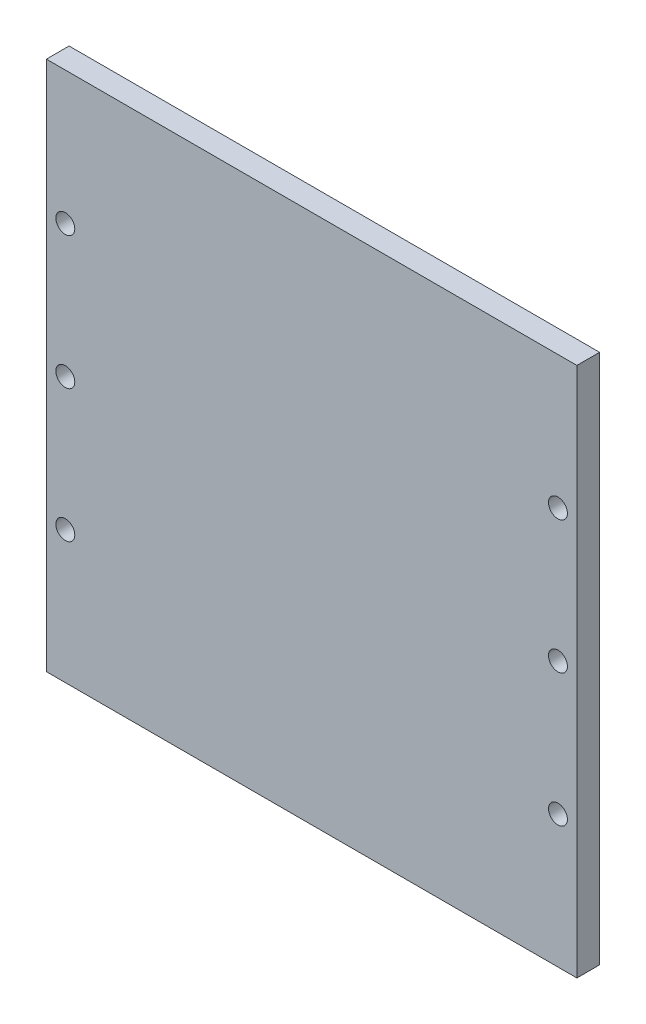
ISO-10303-21;
HEADER;
FILE_DESCRIPTION(('STEP AP214'),'2;1');
FILE_NAME('part.step','',(''),(''),'','','');
FILE_SCHEMA(('AUTOMOTIVE_DESIGN { 1 0 10303 214 1 1 1 1 }'));
ENDSEC;
DATA;
#1=APPLICATION_CONTEXT('core data for automotive mechanical design processes');
#2=APPLICATION_PROTOCOL_DEFINITION('international standard','automotive_design',2000,#1);
#3=PRODUCT_CONTEXT('',#1,'mechanical');
#4=PRODUCT('Part','Part','',(#3));
#5=PRODUCT_RELATED_PRODUCT_CATEGORY('part','',(#4));
#6=PRODUCT_DEFINITION_FORMATION('','',#4);
#7=PRODUCT_DEFINITION_CONTEXT('part definition',#1,'design');
#8=PRODUCT_DEFINITION('design','',#6,#7);
#9=PRODUCT_DEFINITION_SHAPE('','',#8);
#10=(LENGTH_UNIT() NAMED_UNIT(*) SI_UNIT(.MILLI.,.METRE.));
#11=(NAMED_UNIT(*) PLANE_ANGLE_UNIT() SI_UNIT($,.RADIAN.));
#12=(NAMED_UNIT(*) SI_UNIT($,.STERADIAN.) SOLID_ANGLE_UNIT());
#13=UNCERTAINTY_MEASURE_WITH_UNIT(LENGTH_MEASURE(1.E-05),#10,'distance_accuracy_value','');
#14=(GEOMETRIC_REPRESENTATION_CONTEXT(3) GLOBAL_UNCERTAINTY_ASSIGNED_CONTEXT((#13)) GLOBAL_UNIT_ASSIGNED_CONTEXT((#10,
#11,#12)) REPRESENTATION_CONTEXT('',''));
#15=CARTESIAN_POINT('',(0.,0.,0.));
#16=DIRECTION('',(0.,0.,1.));
#17=DIRECTION('',(1.,0.,0.));
#18=AXIS2_PLACEMENT_3D('',#15,#16,#17);
#19=CARTESIAN_POINT('',(35.585,35.585,3.048));
#20=DIRECTION('',(-1.,0.,0.));
#21=DIRECTION('',(0.,-1.,0.));
#22=AXIS2_PLACEMENT_3D('',#19,#20,#21);
#23=PLANE('',#22);
#24=DIRECTION('',(0.,1.,0.));
#25=VECTOR('',#24,1.);
#26=CARTESIAN_POINT('',(35.585,35.585,0.));
#27=LINE('',#26,#25);
#28=CARTESIAN_POINT('',(35.585,-35.585,0.));
#29=VERTEX_POINT('',#28);
#30=CARTESIAN_POINT('',(35.585,35.585,0.));
#31=VERTEX_POINT('',#30);
#32=EDGE_CURVE('E102',#29,#31,#27,.T.);
#33=ORIENTED_EDGE('',*,*,#32,.T.);
#34=DIRECTION('',(0.,0.,-1.));
#35=VECTOR('',#34,1.);
#36=CARTESIAN_POINT('',(35.585,35.585,3.048));
#37=LINE('',#36,#35);
#38=CARTESIAN_POINT('',(35.585,35.585,3.048));
#39=VERTEX_POINT('',#38);
#40=EDGE_CURVE('E11',#39,#31,#37,.T.);
#41=ORIENTED_EDGE('',*,*,#40,.F.);
#42=DIRECTION('',(0.,1.,0.));
#43=VECTOR('',#42,1.);
#44=CARTESIAN_POINT('',(35.585,35.585,3.048));
#45=LINE('',#44,#43);
#46=CARTESIAN_POINT('',(35.585,-35.585,3.048));
#47=VERTEX_POINT('',#46);
#48=EDGE_CURVE('E89',#47,#39,#45,.T.);
#49=ORIENTED_EDGE('',*,*,#48,.F.);
#50=DIRECTION('',(0.,0.,-1.));
#51=VECTOR('',#50,1.);
#52=CARTESIAN_POINT('',(35.585,-35.585,3.048));
#53=LINE('',#52,#51);
#54=EDGE_CURVE('E98',#47,#29,#53,.T.);
#55=ORIENTED_EDGE('',*,*,#54,.T.);
#56=EDGE_LOOP('',(#33,#41,#49,#55));
#57=FACE_BOUND('',#56,.T.);
#58=ADVANCED_FACE('F36',(#57),#23,.F.);
#59=CARTESIAN_POINT('',(-35.585,35.585,3.048));
#60=DIRECTION('',(0.,-1.,0.));
#61=DIRECTION('',(0.,0.,-1.));
#62=AXIS2_PLACEMENT_3D('',#59,#60,#61);
#63=PLANE('',#62);
#64=DIRECTION('',(-1.,0.,0.));
#65=VECTOR('',#64,1.);
#66=CARTESIAN_POINT('',(-35.585,35.585,0.));
#67=LINE('',#66,#65);
#68=CARTESIAN_POINT('',(-35.585,35.585,0.));
#69=VERTEX_POINT('',#68);
#70=EDGE_CURVE('E93',#31,#69,#67,.T.);
#71=ORIENTED_EDGE('',*,*,#70,.T.);
#72=DIRECTION('',(0.,0.,-1.));
#73=VECTOR('',#72,1.);
#74=CARTESIAN_POINT('',(-35.585,35.585,3.048));
#75=LINE('',#74,#73);
#76=CARTESIAN_POINT('',(-35.585,35.585,3.048));
#77=VERTEX_POINT('',#76);
#78=EDGE_CURVE('E45',#77,#69,#75,.T.);
#79=ORIENTED_EDGE('',*,*,#78,.F.);
#80=DIRECTION('',(-1.,0.,0.));
#81=VECTOR('',#80,1.);
#82=CARTESIAN_POINT('',(-35.585,35.585,3.048));
#83=LINE('',#82,#81);
#84=EDGE_CURVE('E84',#39,#77,#83,.T.);
#85=ORIENTED_EDGE('',*,*,#84,.F.);
#86=ORIENTED_EDGE('',*,*,#40,.T.);
#87=EDGE_LOOP('',(#71,#79,#85,#86));
#88=FACE_BOUND('',#87,.T.);
#89=ADVANCED_FACE('F92',(#88),#63,.F.);
#90=CARTESIAN_POINT('',(-35.585,35.585,3.048));
#91=DIRECTION('',(1.,0.,0.));
#92=DIRECTION('',(0.,1.,0.));
#93=AXIS2_PLACEMENT_3D('',#90,#91,#92);
#94=PLANE('',#93);
#95=DIRECTION('',(0.,-1.,0.));
#96=VECTOR('',#95,1.);
#97=CARTESIAN_POINT('',(-35.585,35.585,0.));
#98=LINE('',#97,#96);
#99=CARTESIAN_POINT('',(-35.585,-35.585,0.));
#100=VERTEX_POINT('',#99);
#101=EDGE_CURVE('E71',#69,#100,#98,.T.);
#102=ORIENTED_EDGE('',*,*,#101,.T.);
#103=DIRECTION('',(0.,0.,-1.));
#104=VECTOR('',#103,1.);
#105=CARTESIAN_POINT('',(-35.585,-35.585,3.048));
#106=LINE('',#105,#104);
#107=CARTESIAN_POINT('',(-35.585,-35.585,3.048));
#108=VERTEX_POINT('',#107);
#109=EDGE_CURVE('E94',#108,#100,#106,.T.);
#110=ORIENTED_EDGE('',*,*,#109,.F.);
#111=DIRECTION('',(0.,-1.,0.));
#112=VECTOR('',#111,1.);
#113=CARTESIAN_POINT('',(-35.585,35.585,3.048));
#114=LINE('',#113,#112);
#115=EDGE_CURVE('E87',#77,#108,#114,.T.);
#116=ORIENTED_EDGE('',*,*,#115,.F.);
#117=ORIENTED_EDGE('',*,*,#78,.T.);
#118=EDGE_LOOP('',(#102,#110,#116,#117));
#119=FACE_BOUND('',#118,.T.);
#120=ADVANCED_FACE('F96',(#119),#94,.F.);
#121=CARTESIAN_POINT('',(-35.585,-35.585,3.048));
#122=DIRECTION('',(0.,1.,0.));
#123=DIRECTION('',(0.,0.,1.));
#124=AXIS2_PLACEMENT_3D('',#121,#122,#123);
#125=PLANE('',#124);
#126=DIRECTION('',(1.,0.,0.));
#127=VECTOR('',#126,1.);
#128=CARTESIAN_POINT('',(-35.585,-35.585,0.));
#129=LINE('',#128,#127);
#130=EDGE_CURVE('E77',#100,#29,#129,.T.);
#131=ORIENTED_EDGE('',*,*,#130,.T.);
#132=ORIENTED_EDGE('',*,*,#54,.F.);
#133=DIRECTION('',(1.,0.,0.));
#134=VECTOR('',#133,1.);
#135=CARTESIAN_POINT('',(-35.585,-35.585,3.048));
#136=LINE('',#135,#134);
#137=EDGE_CURVE('E54',#108,#47,#136,.T.);
#138=ORIENTED_EDGE('',*,*,#137,.F.);
#139=ORIENTED_EDGE('',*,*,#109,.T.);
#140=EDGE_LOOP('',(#131,#132,#138,#139));
#141=FACE_BOUND('',#140,.T.);
#142=ADVANCED_FACE('F161',(#141),#125,.F.);
#143=CARTESIAN_POINT('',(0.,0.,3.048));
#144=DIRECTION('',(0.,0.,1.));
#145=DIRECTION('',(1.,0.,0.));
#146=AXIS2_PLACEMENT_3D('',#143,#144,#145);
#147=PLANE('',#146);
#148=CARTESIAN_POINT('',(33.045,-0.0250000000000007,3.048));
#149=DIRECTION('',(0.,0.,1.));
#150=DIRECTION('',(1.,0.,0.));
#151=AXIS2_PLACEMENT_3D('',#148,#149,#150);
#152=CIRCLE('',#151,1.27);
#153=CARTESIAN_POINT('',(34.315,-0.0250000000000007,3.048));
#154=VERTEX_POINT('',#153);
#155=EDGE_CURVE('E251',#154,#154,#152,.T.);
#156=ORIENTED_EDGE('',*,*,#155,.F.);
#157=EDGE_LOOP('',(#156));
#158=FACE_BOUND('',#157,.T.);
#159=CARTESIAN_POINT('',(33.045,17.755,3.048));
#160=DIRECTION('',(0.,0.,1.));
#161=DIRECTION('',(1.,0.,0.));
#162=AXIS2_PLACEMENT_3D('',#159,#160,#161);
#163=CIRCLE('',#162,1.27);
#164=CARTESIAN_POINT('',(34.315,17.755,3.048));
#165=VERTEX_POINT('',#164);
#166=EDGE_CURVE('E247',#165,#165,#163,.T.);
#167=ORIENTED_EDGE('',*,*,#166,.F.);
#168=EDGE_LOOP('',(#167));
#169=FACE_BOUND('',#168,.T.);
#170=CARTESIAN_POINT('',(-33.045,-17.805,3.048));
#171=DIRECTION('',(0.,0.,1.));
#172=DIRECTION('',(-1.,0.,0.));
#173=AXIS2_PLACEMENT_3D('',#170,#171,#172);
#174=CIRCLE('',#173,1.27);
#175=CARTESIAN_POINT('',(-34.315,-17.805,3.048));
#176=VERTEX_POINT('',#175);
#177=EDGE_CURVE('E234',#176,#176,#174,.T.);
#178=ORIENTED_EDGE('',*,*,#177,.F.);
#179=EDGE_LOOP('',(#178));
#180=FACE_BOUND('',#179,.T.);
#181=CARTESIAN_POINT('',(-33.045,-0.0250000000000007,3.048));
#182=DIRECTION('',(0.,0.,1.));
#183=DIRECTION('',(-1.,0.,0.));
#184=AXIS2_PLACEMENT_3D('',#181,#182,#183);
#185=CIRCLE('',#184,1.27);
#186=CARTESIAN_POINT('',(-34.315,-0.0250000000000007,3.048));
#187=VERTEX_POINT('',#186);
#188=EDGE_CURVE('E248',#187,#187,#185,.T.);
#189=ORIENTED_EDGE('',*,*,#188,.F.);
#190=EDGE_LOOP('',(#189));
#191=FACE_BOUND('',#190,.T.);
#192=CARTESIAN_POINT('',(-33.045,17.755,3.048));
#193=DIRECTION('',(0.,0.,1.));
#194=DIRECTION('',(-1.,0.,0.));
#195=AXIS2_PLACEMENT_3D('',#192,#193,#194);
#196=CIRCLE('',#195,1.27);
#197=CARTESIAN_POINT('',(-34.315,17.755,3.048));
#198=VERTEX_POINT('',#197);
#199=EDGE_CURVE('E254',#198,#198,#196,.T.);
#200=ORIENTED_EDGE('',*,*,#199,.F.);
#201=EDGE_LOOP('',(#200));
#202=FACE_BOUND('',#201,.T.);
#203=CARTESIAN_POINT('',(33.045,-17.805,3.048));
#204=DIRECTION('',(0.,0.,1.));
#205=DIRECTION('',(1.,0.,0.));
#206=AXIS2_PLACEMENT_3D('',#203,#204,#205);
#207=CIRCLE('',#206,1.27);
#208=CARTESIAN_POINT('',(34.315,-17.805,3.048));
#209=VERTEX_POINT('',#208);
#210=EDGE_CURVE('E114',#209,#209,#207,.T.);
#211=ORIENTED_EDGE('',*,*,#210,.F.);
#212=EDGE_LOOP('',(#211));
#213=FACE_BOUND('',#212,.T.);
#214=ORIENTED_EDGE('',*,*,#48,.T.);
#215=ORIENTED_EDGE('',*,*,#84,.T.);
#216=ORIENTED_EDGE('',*,*,#115,.T.);
#217=ORIENTED_EDGE('',*,*,#137,.T.);
#218=EDGE_LOOP('',(#214,#215,#216,#217));
#219=FACE_BOUND('',#218,.T.);
#220=ADVANCED_FACE('F85',(#158,#169,#180,#191,#202,#213,#219),#147,.T.);
#221=CARTESIAN_POINT('',(0.,0.,0.));
#222=DIRECTION('',(0.,0.,1.));
#223=DIRECTION('',(1.,0.,0.));
#224=AXIS2_PLACEMENT_3D('',#221,#222,#223);
#225=PLANE('',#224);
#226=CARTESIAN_POINT('',(33.045,-0.0250000000000007,0.));
#227=DIRECTION('',(0.,0.,1.));
#228=DIRECTION('',(1.,0.,0.));
#229=AXIS2_PLACEMENT_3D('',#226,#227,#228);
#230=CIRCLE('',#229,1.27);
#231=CARTESIAN_POINT('',(34.315,-0.0250000000000007,0.));
#232=VERTEX_POINT('',#231);
#233=EDGE_CURVE('E39',#232,#232,#230,.T.);
#234=ORIENTED_EDGE('',*,*,#233,.T.);
#235=EDGE_LOOP('',(#234));
#236=FACE_BOUND('',#235,.T.);
#237=CARTESIAN_POINT('',(33.045,17.755,0.));
#238=DIRECTION('',(0.,0.,1.));
#239=DIRECTION('',(1.,0.,0.));
#240=AXIS2_PLACEMENT_3D('',#237,#238,#239);
#241=CIRCLE('',#240,1.27);
#242=CARTESIAN_POINT('',(34.315,17.755,0.));
#243=VERTEX_POINT('',#242);
#244=EDGE_CURVE('E122',#243,#243,#241,.T.);
#245=ORIENTED_EDGE('',*,*,#244,.T.);
#246=EDGE_LOOP('',(#245));
#247=FACE_BOUND('',#246,.T.);
#248=CARTESIAN_POINT('',(-33.045,-17.805,0.));
#249=DIRECTION('',(0.,0.,1.));
#250=DIRECTION('',(1.,0.,0.));
#251=AXIS2_PLACEMENT_3D('',#248,#249,#250);
#252=CIRCLE('',#251,1.27);
#253=CARTESIAN_POINT('',(-31.775,-17.805,0.));
#254=VERTEX_POINT('',#253);
#255=EDGE_CURVE('E120',#254,#254,#252,.T.);
#256=ORIENTED_EDGE('',*,*,#255,.T.);
#257=EDGE_LOOP('',(#256));
#258=FACE_BOUND('',#257,.T.);
#259=CARTESIAN_POINT('',(-33.045,-0.0250000000000007,0.));
#260=DIRECTION('',(0.,0.,1.));
#261=DIRECTION('',(1.,0.,0.));
#262=AXIS2_PLACEMENT_3D('',#259,#260,#261);
#263=CIRCLE('',#262,1.27);
#264=CARTESIAN_POINT('',(-31.775,-0.0250000000000007,0.));
#265=VERTEX_POINT('',#264);
#266=EDGE_CURVE('E117',#265,#265,#263,.T.);
#267=ORIENTED_EDGE('',*,*,#266,.T.);
#268=EDGE_LOOP('',(#267));
#269=FACE_BOUND('',#268,.T.);
#270=CARTESIAN_POINT('',(-33.045,17.755,0.));
#271=DIRECTION('',(0.,0.,1.));
#272=DIRECTION('',(1.,0.,0.));
#273=AXIS2_PLACEMENT_3D('',#270,#271,#272);
#274=CIRCLE('',#273,1.27);
#275=CARTESIAN_POINT('',(-31.775,17.755,0.));
#276=VERTEX_POINT('',#275);
#277=EDGE_CURVE('E113',#276,#276,#274,.T.);
#278=ORIENTED_EDGE('',*,*,#277,.T.);
#279=EDGE_LOOP('',(#278));
#280=FACE_BOUND('',#279,.T.);
#281=CARTESIAN_POINT('',(33.045,-17.805,0.));
#282=DIRECTION('',(0.,0.,1.));
#283=DIRECTION('',(1.,0.,0.));
#284=AXIS2_PLACEMENT_3D('',#281,#282,#283);
#285=CIRCLE('',#284,1.27);
#286=CARTESIAN_POINT('',(34.315,-17.805,0.));
#287=VERTEX_POINT('',#286);
#288=EDGE_CURVE('E110',#287,#287,#285,.T.);
#289=ORIENTED_EDGE('',*,*,#288,.T.);
#290=EDGE_LOOP('',(#289));
#291=FACE_BOUND('',#290,.T.);
#292=ORIENTED_EDGE('',*,*,#32,.F.);
#293=ORIENTED_EDGE('',*,*,#130,.F.);
#294=ORIENTED_EDGE('',*,*,#101,.F.);
#295=ORIENTED_EDGE('',*,*,#70,.F.);
#296=EDGE_LOOP('',(#292,#293,#294,#295));
#297=FACE_BOUND('',#296,.T.);
#298=ADVANCED_FACE('F129',(#236,#247,#258,#269,#280,#291,#297),#225,.F.);
#299=CARTESIAN_POINT('',(33.045,-17.805,-6.952));
#300=DIRECTION('',(0.,0.,1.));
#301=DIRECTION('',(1.,0.,0.));
#302=AXIS2_PLACEMENT_3D('',#299,#300,#301);
#303=CYLINDRICAL_SURFACE('',#302,1.27);
#304=ORIENTED_EDGE('',*,*,#210,.T.);
#305=EDGE_LOOP('',(#304));
#306=FACE_BOUND('',#305,.T.);
#307=ORIENTED_EDGE('',*,*,#288,.F.);
#308=EDGE_LOOP('',(#307));
#309=FACE_BOUND('',#308,.T.);
#310=ADVANCED_FACE('F152',(#306,#309),#303,.F.);
#311=CARTESIAN_POINT('',(-33.045,17.755,-6.952));
#312=DIRECTION('',(0.,0.,1.));
#313=DIRECTION('',(1.,0.,0.));
#314=AXIS2_PLACEMENT_3D('',#311,#312,#313);
#315=CYLINDRICAL_SURFACE('',#314,1.27);
#316=ORIENTED_EDGE('',*,*,#199,.T.);
#317=EDGE_LOOP('',(#316));
#318=FACE_BOUND('',#317,.T.);
#319=ORIENTED_EDGE('',*,*,#277,.F.);
#320=EDGE_LOOP('',(#319));
#321=FACE_BOUND('',#320,.T.);
#322=ADVANCED_FACE('F158',(#318,#321),#315,.F.);
#323=CARTESIAN_POINT('',(-33.045,-0.0250000000000007,-6.952));
#324=DIRECTION('',(0.,0.,1.));
#325=DIRECTION('',(1.,0.,0.));
#326=AXIS2_PLACEMENT_3D('',#323,#324,#325);
#327=CYLINDRICAL_SURFACE('',#326,1.27);
#328=ORIENTED_EDGE('',*,*,#188,.T.);
#329=EDGE_LOOP('',(#328));
#330=FACE_BOUND('',#329,.T.);
#331=ORIENTED_EDGE('',*,*,#266,.F.);
#332=EDGE_LOOP('',(#331));
#333=FACE_BOUND('',#332,.T.);
#334=ADVANCED_FACE('F199',(#330,#333),#327,.F.);
#335=CARTESIAN_POINT('',(-33.045,-17.805,-6.952));
#336=DIRECTION('',(0.,0.,1.));
#337=DIRECTION('',(1.,0.,0.));
#338=AXIS2_PLACEMENT_3D('',#335,#336,#337);
#339=CYLINDRICAL_SURFACE('',#338,1.27);
#340=ORIENTED_EDGE('',*,*,#177,.T.);
#341=EDGE_LOOP('',(#340));
#342=FACE_BOUND('',#341,.T.);
#343=ORIENTED_EDGE('',*,*,#255,.F.);
#344=EDGE_LOOP('',(#343));
#345=FACE_BOUND('',#344,.T.);
#346=ADVANCED_FACE('F139',(#342,#345),#339,.F.);
#347=CARTESIAN_POINT('',(33.045,17.755,-6.952));
#348=DIRECTION('',(0.,0.,1.));
#349=DIRECTION('',(1.,0.,0.));
#350=AXIS2_PLACEMENT_3D('',#347,#348,#349);
#351=CYLINDRICAL_SURFACE('',#350,1.27);
#352=ORIENTED_EDGE('',*,*,#166,.T.);
#353=EDGE_LOOP('',(#352));
#354=FACE_BOUND('',#353,.T.);
#355=ORIENTED_EDGE('',*,*,#244,.F.);
#356=EDGE_LOOP('',(#355));
#357=FACE_BOUND('',#356,.T.);
#358=ADVANCED_FACE('F133',(#354,#357),#351,.F.);
#359=CARTESIAN_POINT('',(33.045,-0.0250000000000007,-6.952));
#360=DIRECTION('',(0.,0.,1.));
#361=DIRECTION('',(1.,0.,0.));
#362=AXIS2_PLACEMENT_3D('',#359,#360,#361);
#363=CYLINDRICAL_SURFACE('',#362,1.27);
#364=ORIENTED_EDGE('',*,*,#155,.T.);
#365=EDGE_LOOP('',(#364));
#366=FACE_BOUND('',#365,.T.);
#367=ORIENTED_EDGE('',*,*,#233,.F.);
#368=EDGE_LOOP('',(#367));
#369=FACE_BOUND('',#368,.T.);
#370=ADVANCED_FACE('F131',(#366,#369),#363,.F.);
#371=CLOSED_SHELL('',(#58,#89,#120,#142,#220,#298,#310,#322,#334,#346,#358,#370));
#372=MANIFOLD_SOLID_BREP('B2',#371);
#373=ADVANCED_BREP_SHAPE_REPRESENTATION('',(#18,#372),#14);
#374=SHAPE_DEFINITION_REPRESENTATION(#9,#373);
ENDSEC;
END-ISO-10303-21;
